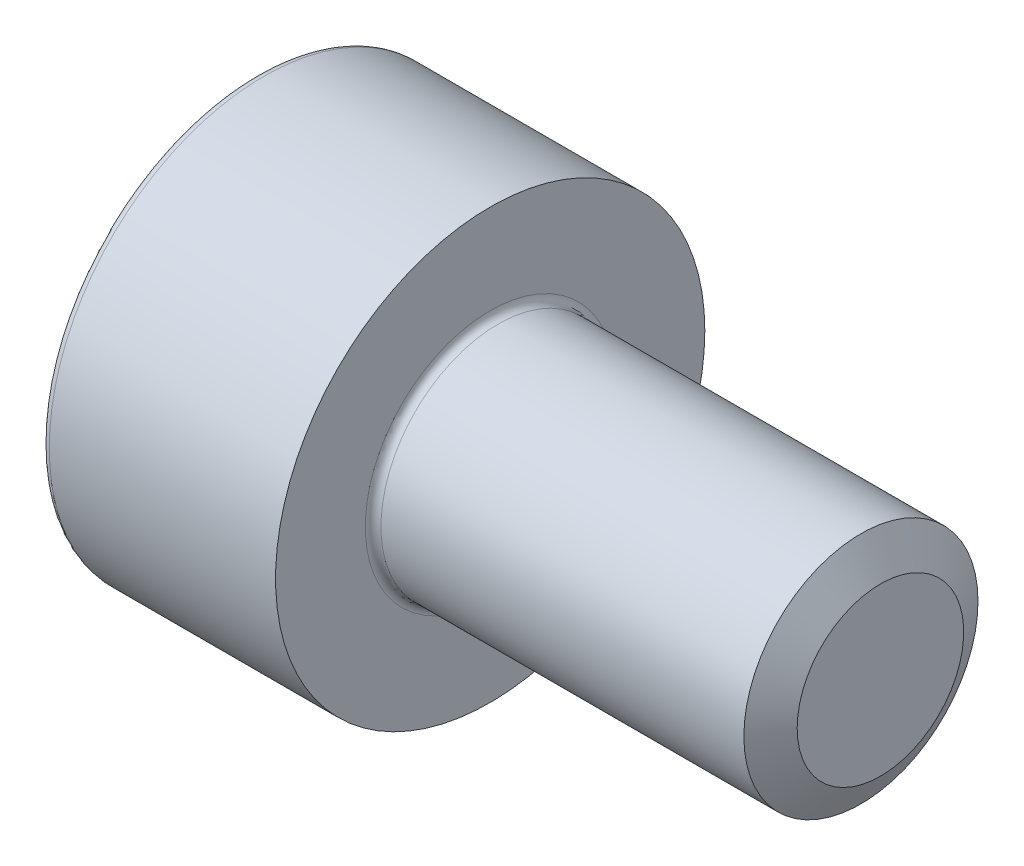
ISO-10303-21;
HEADER;
FILE_DESCRIPTION(('STEP AP214'),'2;1');
FILE_NAME('part.step','',(''),(''),'','','');
FILE_SCHEMA(('AUTOMOTIVE_DESIGN { 1 0 10303 214 1 1 1 1 }'));
ENDSEC;
DATA;
#1=APPLICATION_CONTEXT('core data for automotive mechanical design processes');
#2=APPLICATION_PROTOCOL_DEFINITION('international standard','automotive_design',2000,#1);
#3=PRODUCT_CONTEXT('',#1,'mechanical');
#4=PRODUCT('Part','Part','',(#3));
#5=PRODUCT_RELATED_PRODUCT_CATEGORY('part','',(#4));
#6=PRODUCT_DEFINITION_FORMATION('','',#4);
#7=PRODUCT_DEFINITION_CONTEXT('part definition',#1,'design');
#8=PRODUCT_DEFINITION('design','',#6,#7);
#9=PRODUCT_DEFINITION_SHAPE('','',#8);
#10=(LENGTH_UNIT() NAMED_UNIT(*) SI_UNIT(.MILLI.,.METRE.));
#11=(NAMED_UNIT(*) PLANE_ANGLE_UNIT() SI_UNIT($,.RADIAN.));
#12=(NAMED_UNIT(*) SI_UNIT($,.STERADIAN.) SOLID_ANGLE_UNIT());
#13=UNCERTAINTY_MEASURE_WITH_UNIT(LENGTH_MEASURE(1.E-05),#10,'distance_accuracy_value','');
#14=(GEOMETRIC_REPRESENTATION_CONTEXT(3) GLOBAL_UNCERTAINTY_ASSIGNED_CONTEXT((#13)) GLOBAL_UNIT_ASSIGNED_CONTEXT((#10,
#11,#12)) REPRESENTATION_CONTEXT('',''));
#15=CARTESIAN_POINT('',(0.,0.,0.));
#16=DIRECTION('',(0.,0.,1.));
#17=DIRECTION('',(1.,0.,0.));
#18=AXIS2_PLACEMENT_3D('',#15,#16,#17);
#19=CARTESIAN_POINT('',(0.,0.,0.));
#20=DIRECTION('',(1.,0.,0.));
#21=DIRECTION('',(0.,0.,-1.));
#22=AXIS2_PLACEMENT_3D('',#19,#20,#21);
#23=CYLINDRICAL_SURFACE('',#22,1.5);
#24=CARTESIAN_POINT('',(3.1,0.,0.));
#25=DIRECTION('',(1.,0.,0.));
#26=DIRECTION('',(0.,0.,-1.));
#27=AXIS2_PLACEMENT_3D('',#24,#25,#26);
#28=CIRCLE('',#27,1.5);
#29=CARTESIAN_POINT('',(3.1,0.,-1.5));
#30=VERTEX_POINT('',#29);
#31=EDGE_CURVE('E156',#30,#30,#28,.T.);
#32=ORIENTED_EDGE('',*,*,#31,.T.);
#33=EDGE_LOOP('',(#32));
#34=FACE_BOUND('',#33,.T.);
#35=CARTESIAN_POINT('',(7.75,0.,0.));
#36=DIRECTION('',(-1.,0.,0.));
#37=DIRECTION('',(0.,0.,1.));
#38=AXIS2_PLACEMENT_3D('',#35,#36,#37);
#39=CIRCLE('',#38,1.5);
#40=CARTESIAN_POINT('',(7.75,0.,1.5));
#41=VERTEX_POINT('',#40);
#42=EDGE_CURVE('E301',#41,#41,#39,.T.);
#43=ORIENTED_EDGE('',*,*,#42,.T.);
#44=EDGE_LOOP('',(#43));
#45=FACE_BOUND('',#44,.T.);
#46=ADVANCED_FACE('F53',(#34,#45),#23,.T.);
#47=CARTESIAN_POINT('',(0.,0.,0.));
#48=DIRECTION('',(-1.,0.,0.));
#49=DIRECTION('',(0.,0.,1.));
#50=AXIS2_PLACEMENT_3D('',#47,#48,#49);
#51=PLANE('',#50);
#52=CARTESIAN_POINT('',(0.,0.,0.));
#53=DIRECTION('',(-1.,0.,0.));
#54=DIRECTION('',(0.,0.,1.));
#55=AXIS2_PLACEMENT_3D('',#52,#53,#54);
#56=CIRCLE('',#55,2.65);
#57=CARTESIAN_POINT('',(0.,0.,2.65));
#58=VERTEX_POINT('',#57);
#59=EDGE_CURVE('E11',#58,#58,#56,.T.);
#60=ORIENTED_EDGE('',*,*,#59,.T.);
#61=EDGE_LOOP('',(#60));
#62=FACE_BOUND('',#61,.T.);
#63=DIRECTION('',(0.,0.5,0.866025403784439));
#64=VECTOR('',#63,1.);
#65=CARTESIAN_POINT('',(0.,-1.435,0.));
#66=LINE('',#65,#64);
#67=CARTESIAN_POINT('',(0.,-1.435,0.));
#68=VERTEX_POINT('',#67);
#69=CARTESIAN_POINT('',(0.,-0.7175,1.24274645443067));
#70=VERTEX_POINT('',#69);
#71=EDGE_CURVE('E68',#68,#70,#66,.T.);
#72=ORIENTED_EDGE('',*,*,#71,.F.);
#73=DIRECTION('',(0.,-0.5,0.866025403784439));
#74=VECTOR('',#73,1.);
#75=CARTESIAN_POINT('',(0.,-0.7175,-1.24274645443067));
#76=LINE('',#75,#74);
#77=CARTESIAN_POINT('',(0.,-0.7175,-1.24274645443067));
#78=VERTEX_POINT('',#77);
#79=EDGE_CURVE('E152',#78,#68,#76,.T.);
#80=ORIENTED_EDGE('',*,*,#79,.F.);
#81=DIRECTION('',(0.,-1.,0.));
#82=VECTOR('',#81,1.);
#83=CARTESIAN_POINT('',(0.,0.7175,-1.24274645443067));
#84=LINE('',#83,#82);
#85=CARTESIAN_POINT('',(0.,0.7175,-1.24274645443067));
#86=VERTEX_POINT('',#85);
#87=EDGE_CURVE('E150',#86,#78,#84,.T.);
#88=ORIENTED_EDGE('',*,*,#87,.F.);
#89=DIRECTION('',(0.,-0.5,-0.866025403784439));
#90=VECTOR('',#89,1.);
#91=CARTESIAN_POINT('',(0.,1.435,0.));
#92=LINE('',#91,#90);
#93=CARTESIAN_POINT('',(0.,1.435,0.));
#94=VERTEX_POINT('',#93);
#95=EDGE_CURVE('E116',#94,#86,#92,.T.);
#96=ORIENTED_EDGE('',*,*,#95,.F.);
#97=DIRECTION('',(0.,0.5,-0.866025403784439));
#98=VECTOR('',#97,1.);
#99=CARTESIAN_POINT('',(0.,0.7175,1.24274645443067));
#100=LINE('',#99,#98);
#101=CARTESIAN_POINT('',(0.,0.7175,1.24274645443067));
#102=VERTEX_POINT('',#101);
#103=EDGE_CURVE('E146',#102,#94,#100,.T.);
#104=ORIENTED_EDGE('',*,*,#103,.F.);
#105=DIRECTION('',(0.,1.,0.));
#106=VECTOR('',#105,1.);
#107=CARTESIAN_POINT('',(0.,-0.7175,1.24274645443067));
#108=LINE('',#107,#106);
#109=EDGE_CURVE('E142',#70,#102,#108,.T.);
#110=ORIENTED_EDGE('',*,*,#109,.F.);
#111=EDGE_LOOP('',(#72,#80,#88,#96,#104,#110));
#112=FACE_BOUND('',#111,.T.);
#113=ADVANCED_FACE('F192',(#62,#112),#51,.T.);
#114=CARTESIAN_POINT('',(0.,0.,0.));
#115=DIRECTION('',(1.,0.,0.));
#116=DIRECTION('',(0.,0.,-1.));
#117=AXIS2_PLACEMENT_3D('',#114,#115,#116);
#118=CYLINDRICAL_SURFACE('',#117,2.75);
#119=CARTESIAN_POINT('',(0.1,0.,0.));
#120=DIRECTION('',(-1.,0.,0.));
#121=DIRECTION('',(0.,0.,1.));
#122=AXIS2_PLACEMENT_3D('',#119,#120,#121);
#123=CIRCLE('',#122,2.75);
#124=CARTESIAN_POINT('',(0.1,0.,2.75));
#125=VERTEX_POINT('',#124);
#126=EDGE_CURVE('E61',#125,#125,#123,.F.);
#127=ORIENTED_EDGE('',*,*,#126,.T.);
#128=EDGE_LOOP('',(#127));
#129=FACE_BOUND('',#128,.T.);
#130=CARTESIAN_POINT('',(3.,0.,0.));
#131=DIRECTION('',(1.,0.,0.));
#132=DIRECTION('',(0.,0.,-1.));
#133=AXIS2_PLACEMENT_3D('',#130,#131,#132);
#134=CIRCLE('',#133,2.75);
#135=CARTESIAN_POINT('',(3.,0.,-2.75));
#136=VERTEX_POINT('',#135);
#137=EDGE_CURVE('E167',#136,#136,#134,.T.);
#138=ORIENTED_EDGE('',*,*,#137,.F.);
#139=EDGE_LOOP('',(#138));
#140=FACE_BOUND('',#139,.T.);
#141=ADVANCED_FACE('F173',(#129,#140),#118,.T.);
#142=CARTESIAN_POINT('',(3.,2.75,0.));
#143=DIRECTION('',(1.,0.,0.));
#144=DIRECTION('',(0.,0.,-1.));
#145=AXIS2_PLACEMENT_3D('',#142,#143,#144);
#146=PLANE('',#145);
#147=ORIENTED_EDGE('',*,*,#137,.T.);
#148=EDGE_LOOP('',(#147));
#149=FACE_BOUND('',#148,.T.);
#150=CARTESIAN_POINT('',(3.,0.,0.));
#151=DIRECTION('',(1.,0.,0.));
#152=DIRECTION('',(0.,0.,-1.));
#153=AXIS2_PLACEMENT_3D('',#150,#151,#152);
#154=CIRCLE('',#153,1.6);
#155=CARTESIAN_POINT('',(3.,0.,-1.6));
#156=VERTEX_POINT('',#155);
#157=EDGE_CURVE('E164',#156,#156,#154,.T.);
#158=ORIENTED_EDGE('',*,*,#157,.F.);
#159=EDGE_LOOP('',(#158));
#160=FACE_BOUND('',#159,.T.);
#161=ADVANCED_FACE('F207',(#149,#160),#146,.T.);
#162=CARTESIAN_POINT('',(3.1,0.,0.));
#163=DIRECTION('',(1.,0.,0.));
#164=DIRECTION('',(0.,0.,-1.));
#165=AXIS2_PLACEMENT_3D('',#162,#163,#164);
#166=TOROIDAL_SURFACE('',#165,1.6,0.1);
#167=ORIENTED_EDGE('',*,*,#157,.T.);
#168=EDGE_LOOP('',(#167));
#169=FACE_BOUND('',#168,.T.);
#170=ORIENTED_EDGE('',*,*,#31,.F.);
#171=EDGE_LOOP('',(#170));
#172=FACE_BOUND('',#171,.T.);
#173=ADVANCED_FACE('F203',(#169,#172),#166,.F.);
#174=CARTESIAN_POINT('',(1.3,-1.435,0.));
#175=DIRECTION('',(0.,-0.866025403784439,0.5));
#176=DIRECTION('',(0.,-0.5,-0.866025403784439));
#177=AXIS2_PLACEMENT_3D('',#174,#175,#176);
#178=PLANE('',#177);
#179=ORIENTED_EDGE('',*,*,#71,.T.);
#180=DIRECTION('',(-1.,0.,0.));
#181=VECTOR('',#180,1.);
#182=CARTESIAN_POINT('',(1.3,-0.7175,1.24274645443067));
#183=LINE('',#182,#181);
#184=CARTESIAN_POINT('',(1.3,-0.7175,1.24274645443067));
#185=VERTEX_POINT('',#184);
#186=EDGE_CURVE('E98',#185,#70,#183,.T.);
#187=ORIENTED_EDGE('',*,*,#186,.F.);
#188=DIRECTION('',(0.,0.5,0.866025403784439));
#189=VECTOR('',#188,1.);
#190=CARTESIAN_POINT('',(1.3,-1.435,0.));
#191=LINE('',#190,#189);
#192=CARTESIAN_POINT('',(1.3,-1.435,0.));
#193=VERTEX_POINT('',#192);
#194=EDGE_CURVE('E154',#193,#185,#191,.T.);
#195=ORIENTED_EDGE('',*,*,#194,.F.);
#196=DIRECTION('',(-1.,0.,0.));
#197=VECTOR('',#196,1.);
#198=CARTESIAN_POINT('',(1.3,-1.435,0.));
#199=LINE('',#198,#197);
#200=EDGE_CURVE('E76',#193,#68,#199,.T.);
#201=ORIENTED_EDGE('',*,*,#200,.T.);
#202=EDGE_LOOP('',(#179,#187,#195,#201));
#203=FACE_BOUND('',#202,.T.);
#204=ADVANCED_FACE('F206',(#203),#178,.F.);
#205=CARTESIAN_POINT('',(1.3,-0.7175,-1.24274645443067));
#206=DIRECTION('',(0.,-0.866025403784439,-0.5));
#207=DIRECTION('',(0.,0.5,-0.866025403784439));
#208=AXIS2_PLACEMENT_3D('',#205,#206,#207);
#209=PLANE('',#208);
#210=ORIENTED_EDGE('',*,*,#79,.T.);
#211=ORIENTED_EDGE('',*,*,#200,.F.);
#212=DIRECTION('',(0.,-0.5,0.866025403784439));
#213=VECTOR('',#212,1.);
#214=CARTESIAN_POINT('',(1.3,-0.7175,-1.24274645443067));
#215=LINE('',#214,#213);
#216=CARTESIAN_POINT('',(1.3,-0.7175,-1.24274645443067));
#217=VERTEX_POINT('',#216);
#218=EDGE_CURVE('E128',#217,#193,#215,.T.);
#219=ORIENTED_EDGE('',*,*,#218,.F.);
#220=DIRECTION('',(-1.,0.,0.));
#221=VECTOR('',#220,1.);
#222=CARTESIAN_POINT('',(1.3,-0.7175,-1.24274645443067));
#223=LINE('',#222,#221);
#224=EDGE_CURVE('E120',#217,#78,#223,.T.);
#225=ORIENTED_EDGE('',*,*,#224,.T.);
#226=EDGE_LOOP('',(#210,#211,#219,#225));
#227=FACE_BOUND('',#226,.T.);
#228=ADVANCED_FACE('F256',(#227),#209,.F.);
#229=CARTESIAN_POINT('',(1.3,0.7175,-1.24274645443067));
#230=DIRECTION('',(0.,0.,-1.));
#231=DIRECTION('',(0.,1.,0.));
#232=AXIS2_PLACEMENT_3D('',#229,#230,#231);
#233=PLANE('',#232);
#234=ORIENTED_EDGE('',*,*,#87,.T.);
#235=ORIENTED_EDGE('',*,*,#224,.F.);
#236=DIRECTION('',(0.,-1.,0.));
#237=VECTOR('',#236,1.);
#238=CARTESIAN_POINT('',(1.3,0.7175,-1.24274645443067));
#239=LINE('',#238,#237);
#240=CARTESIAN_POINT('',(1.3,0.7175,-1.24274645443067));
#241=VERTEX_POINT('',#240);
#242=EDGE_CURVE('E124',#241,#217,#239,.T.);
#243=ORIENTED_EDGE('',*,*,#242,.F.);
#244=DIRECTION('',(-1.,0.,0.));
#245=VECTOR('',#244,1.);
#246=CARTESIAN_POINT('',(1.3,0.7175,-1.24274645443067));
#247=LINE('',#246,#245);
#248=EDGE_CURVE('E109',#241,#86,#247,.T.);
#249=ORIENTED_EDGE('',*,*,#248,.T.);
#250=EDGE_LOOP('',(#234,#235,#243,#249));
#251=FACE_BOUND('',#250,.T.);
#252=ADVANCED_FACE('F125',(#251),#233,.F.);
#253=CARTESIAN_POINT('',(1.3,1.435,0.));
#254=DIRECTION('',(0.,0.866025403784439,-0.5));
#255=DIRECTION('',(0.,0.5,0.866025403784439));
#256=AXIS2_PLACEMENT_3D('',#253,#254,#255);
#257=PLANE('',#256);
#258=ORIENTED_EDGE('',*,*,#95,.T.);
#259=ORIENTED_EDGE('',*,*,#248,.F.);
#260=DIRECTION('',(0.,-0.5,-0.866025403784439));
#261=VECTOR('',#260,1.);
#262=CARTESIAN_POINT('',(1.3,1.435,0.));
#263=LINE('',#262,#261);
#264=CARTESIAN_POINT('',(1.3,1.435,0.));
#265=VERTEX_POINT('',#264);
#266=EDGE_CURVE('E113',#265,#241,#263,.T.);
#267=ORIENTED_EDGE('',*,*,#266,.F.);
#268=DIRECTION('',(-1.,0.,0.));
#269=VECTOR('',#268,1.);
#270=CARTESIAN_POINT('',(1.3,1.435,0.));
#271=LINE('',#270,#269);
#272=EDGE_CURVE('E121',#265,#94,#271,.T.);
#273=ORIENTED_EDGE('',*,*,#272,.T.);
#274=EDGE_LOOP('',(#258,#259,#267,#273));
#275=FACE_BOUND('',#274,.T.);
#276=ADVANCED_FACE('F111',(#275),#257,.F.);
#277=CARTESIAN_POINT('',(1.3,0.7175,1.24274645443067));
#278=DIRECTION('',(0.,0.866025403784439,0.5));
#279=DIRECTION('',(0.,-0.5,0.866025403784439));
#280=AXIS2_PLACEMENT_3D('',#277,#278,#279);
#281=PLANE('',#280);
#282=ORIENTED_EDGE('',*,*,#103,.T.);
#283=ORIENTED_EDGE('',*,*,#272,.F.);
#284=DIRECTION('',(0.,0.5,-0.866025403784439));
#285=VECTOR('',#284,1.);
#286=CARTESIAN_POINT('',(1.3,0.7175,1.24274645443067));
#287=LINE('',#286,#285);
#288=CARTESIAN_POINT('',(1.3,0.7175,1.24274645443067));
#289=VERTEX_POINT('',#288);
#290=EDGE_CURVE('E134',#289,#265,#287,.T.);
#291=ORIENTED_EDGE('',*,*,#290,.F.);
#292=DIRECTION('',(-1.,0.,0.));
#293=VECTOR('',#292,1.);
#294=CARTESIAN_POINT('',(1.3,0.7175,1.24274645443067));
#295=LINE('',#294,#293);
#296=EDGE_CURVE('E159',#289,#102,#295,.T.);
#297=ORIENTED_EDGE('',*,*,#296,.T.);
#298=EDGE_LOOP('',(#282,#283,#291,#297));
#299=FACE_BOUND('',#298,.T.);
#300=ADVANCED_FACE('F232',(#299),#281,.F.);
#301=CARTESIAN_POINT('',(1.3,-0.7175,1.24274645443067));
#302=DIRECTION('',(0.,0.,1.));
#303=DIRECTION('',(0.,-1.,0.));
#304=AXIS2_PLACEMENT_3D('',#301,#302,#303);
#305=PLANE('',#304);
#306=ORIENTED_EDGE('',*,*,#109,.T.);
#307=ORIENTED_EDGE('',*,*,#296,.F.);
#308=DIRECTION('',(0.,1.,0.));
#309=VECTOR('',#308,1.);
#310=CARTESIAN_POINT('',(1.3,-0.7175,1.24274645443067));
#311=LINE('',#310,#309);
#312=EDGE_CURVE('E136',#185,#289,#311,.T.);
#313=ORIENTED_EDGE('',*,*,#312,.F.);
#314=ORIENTED_EDGE('',*,*,#186,.T.);
#315=EDGE_LOOP('',(#306,#307,#313,#314));
#316=FACE_BOUND('',#315,.T.);
#317=ADVANCED_FACE('F188',(#316),#305,.F.);
#318=CARTESIAN_POINT('',(1.3,-0.7175,1.24274645443067));
#319=DIRECTION('',(-1.,0.,0.));
#320=DIRECTION('',(0.,0.,1.));
#321=AXIS2_PLACEMENT_3D('',#318,#319,#320);
#322=PLANE('',#321);
#323=ORIENTED_EDGE('',*,*,#194,.T.);
#324=ORIENTED_EDGE('',*,*,#312,.T.);
#325=ORIENTED_EDGE('',*,*,#290,.T.);
#326=ORIENTED_EDGE('',*,*,#266,.T.);
#327=ORIENTED_EDGE('',*,*,#242,.T.);
#328=ORIENTED_EDGE('',*,*,#218,.T.);
#329=EDGE_LOOP('',(#323,#324,#325,#326,#327,#328));
#330=FACE_BOUND('',#329,.T.);
#331=ADVANCED_FACE('F131',(#330),#322,.T.);
#332=CARTESIAN_POINT('',(0.1,0.,0.));
#333=DIRECTION('',(-1.,0.,0.));
#334=DIRECTION('',(0.,0.,1.));
#335=AXIS2_PLACEMENT_3D('',#332,#333,#334);
#336=TOROIDAL_SURFACE('',#335,2.65,0.1);
#337=ORIENTED_EDGE('',*,*,#59,.F.);
#338=EDGE_LOOP('',(#337));
#339=FACE_BOUND('',#338,.T.);
#340=ORIENTED_EDGE('',*,*,#126,.F.);
#341=EDGE_LOOP('',(#340));
#342=FACE_BOUND('',#341,.T.);
#343=ADVANCED_FACE('F55',(#339,#342),#336,.T.);
#344=CARTESIAN_POINT('',(7.75,0.,0.));
#345=DIRECTION('',(-1.,0.,0.));
#346=DIRECTION('',(0.,0.,1.));
#347=AXIS2_PLACEMENT_3D('',#344,#345,#346);
#348=CONICAL_SURFACE('',#347,1.5,1.04718484902493);
#349=CARTESIAN_POINT('',(8.,0.,0.));
#350=DIRECTION('',(-1.,0.,0.));
#351=DIRECTION('',(0.,0.,1.));
#352=AXIS2_PLACEMENT_3D('',#349,#350,#351);
#353=CIRCLE('',#352,1.067);
#354=CARTESIAN_POINT('',(8.,0.,1.067));
#355=VERTEX_POINT('',#354);
#356=EDGE_CURVE('E143',#355,#355,#353,.T.);
#357=ORIENTED_EDGE('',*,*,#356,.T.);
#358=EDGE_LOOP('',(#357));
#359=FACE_BOUND('',#358,.T.);
#360=ORIENTED_EDGE('',*,*,#42,.F.);
#361=EDGE_LOOP('',(#360));
#362=FACE_BOUND('',#361,.T.);
#363=ADVANCED_FACE('F177',(#359,#362),#348,.T.);
#364=CARTESIAN_POINT('',(8.,1.5,0.));
#365=DIRECTION('',(1.,0.,0.));
#366=DIRECTION('',(0.,0.,-1.));
#367=AXIS2_PLACEMENT_3D('',#364,#365,#366);
#368=PLANE('',#367);
#369=ORIENTED_EDGE('',*,*,#356,.F.);
#370=EDGE_LOOP('',(#369));
#371=FACE_BOUND('',#370,.T.);
#372=ADVANCED_FACE('F184',(#371),#368,.T.);
#373=CLOSED_SHELL('',(#46,#113,#141,#161,#173,#204,#228,#252,#276,#300,#317,#331,#343,#363,#372));
#374=MANIFOLD_SOLID_BREP('B2',#373);
#375=ADVANCED_BREP_SHAPE_REPRESENTATION('',(#18,#374),#14);
#376=SHAPE_DEFINITION_REPRESENTATION(#9,#375);
ENDSEC;
END-ISO-10303-21;
